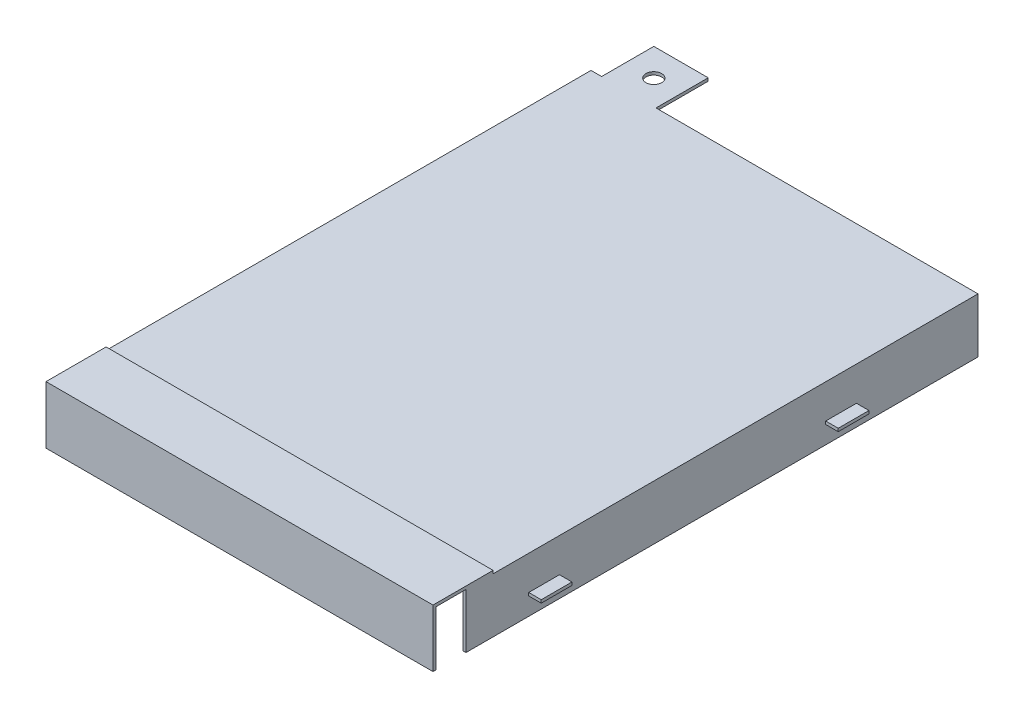
ISO-10303-21;
HEADER;
FILE_DESCRIPTION(('STEP AP214'),'2;1');
FILE_NAME('part.step','',(''),(''),'','','');
FILE_SCHEMA(('AUTOMOTIVE_DESIGN { 1 0 10303 214 1 1 1 1 }'));
ENDSEC;
DATA;
#1=APPLICATION_CONTEXT('core data for automotive mechanical design processes');
#2=APPLICATION_PROTOCOL_DEFINITION('international standard','automotive_design',2000,#1);
#3=PRODUCT_CONTEXT('',#1,'mechanical');
#4=PRODUCT('Part','Part','',(#3));
#5=PRODUCT_RELATED_PRODUCT_CATEGORY('part','',(#4));
#6=PRODUCT_DEFINITION_FORMATION('','',#4);
#7=PRODUCT_DEFINITION_CONTEXT('part definition',#1,'design');
#8=PRODUCT_DEFINITION('design','',#6,#7);
#9=PRODUCT_DEFINITION_SHAPE('','',#8);
#10=(LENGTH_UNIT() NAMED_UNIT(*) SI_UNIT(.MILLI.,.METRE.));
#11=(NAMED_UNIT(*) PLANE_ANGLE_UNIT() SI_UNIT($,.RADIAN.));
#12=(NAMED_UNIT(*) SI_UNIT($,.STERADIAN.) SOLID_ANGLE_UNIT());
#13=UNCERTAINTY_MEASURE_WITH_UNIT(LENGTH_MEASURE(1.E-05),#10,'distance_accuracy_value','');
#14=(GEOMETRIC_REPRESENTATION_CONTEXT(3) GLOBAL_UNCERTAINTY_ASSIGNED_CONTEXT((#13)) GLOBAL_UNIT_ASSIGNED_CONTEXT((#10,
#11,#12)) REPRESENTATION_CONTEXT('',''));
#15=CARTESIAN_POINT('',(0.,0.,0.));
#16=DIRECTION('',(0.,0.,1.));
#17=DIRECTION('',(1.,0.,0.));
#18=AXIS2_PLACEMENT_3D('',#15,#16,#17);
#19=CARTESIAN_POINT('',(-35.575,0.55,-47.075));
#20=DIRECTION('',(1.,0.,0.));
#21=DIRECTION('',(0.,0.,-1.));
#22=AXIS2_PLACEMENT_3D('',#19,#20,#21);
#23=PLANE('',#22);
#24=DIRECTION('',(0.,-1.,0.));
#25=VECTOR('',#24,1.);
#26=CARTESIAN_POINT('',(-35.575,-5.7,-24.725));
#27=LINE('',#26,#25);
#28=CARTESIAN_POINT('',(-35.575,-5.7,-24.725));
#29=VERTEX_POINT('',#28);
#30=CARTESIAN_POINT('',(-35.575,-6.25,-24.725));
#31=VERTEX_POINT('',#30);
#32=EDGE_CURVE('E357',#29,#31,#27,.T.);
#33=ORIENTED_EDGE('',*,*,#32,.F.);
#34=DIRECTION('',(0.,0.,-1.));
#35=VECTOR('',#34,1.);
#36=CARTESIAN_POINT('',(-35.575,-5.7,-24.725));
#37=LINE('',#36,#35);
#38=CARTESIAN_POINT('',(-35.575,-5.7,-19.075));
#39=VERTEX_POINT('',#38);
#40=EDGE_CURVE('E362',#39,#29,#37,.T.);
#41=ORIENTED_EDGE('',*,*,#40,.F.);
#42=DIRECTION('',(0.,1.,0.));
#43=VECTOR('',#42,1.);
#44=CARTESIAN_POINT('',(-35.575,-5.7,-19.075));
#45=LINE('',#44,#43);
#46=CARTESIAN_POINT('',(-35.575,-6.25,-19.075));
#47=VERTEX_POINT('',#46);
#48=EDGE_CURVE('E374',#47,#39,#45,.T.);
#49=ORIENTED_EDGE('',*,*,#48,.F.);
#50=DIRECTION('',(0.,0.,1.));
#51=VECTOR('',#50,1.);
#52=CARTESIAN_POINT('',(-35.575,-6.25,-24.725));
#53=LINE('',#52,#51);
#54=EDGE_CURVE('E371',#31,#47,#53,.T.);
#55=ORIENTED_EDGE('',*,*,#54,.F.);
#56=EDGE_LOOP('',(#33,#41,#49,#55));
#57=FACE_BOUND('',#56,.T.);
#58=DIRECTION('',(0.,-1.,0.));
#59=VECTOR('',#58,1.);
#60=CARTESIAN_POINT('',(-35.575,0.55,-47.075));
#61=LINE('',#60,#59);
#62=CARTESIAN_POINT('',(-35.575,0.55,-47.075));
#63=VERTEX_POINT('',#62);
#64=CARTESIAN_POINT('',(-35.575,-9.5,-47.075));
#65=VERTEX_POINT('',#64);
#66=EDGE_CURVE('E515',#63,#65,#61,.T.);
#67=ORIENTED_EDGE('',*,*,#66,.T.);
#68=DIRECTION('',(0.,0.,-1.));
#69=VECTOR('',#68,1.);
#70=CARTESIAN_POINT('',(-35.575,-9.5,47.075));
#71=LINE('',#70,#69);
#72=CARTESIAN_POINT('',(-35.575,-9.5,47.075));
#73=VERTEX_POINT('',#72);
#74=EDGE_CURVE('E484',#73,#65,#71,.T.);
#75=ORIENTED_EDGE('',*,*,#74,.F.);
#76=DIRECTION('',(0.,-1.,0.));
#77=VECTOR('',#76,1.);
#78=CARTESIAN_POINT('',(-35.575,0.55,47.075));
#79=LINE('',#78,#77);
#80=CARTESIAN_POINT('',(-35.575,0.55,47.075));
#81=VERTEX_POINT('',#80);
#82=EDGE_CURVE('E11',#81,#73,#79,.T.);
#83=ORIENTED_EDGE('',*,*,#82,.F.);
#84=DIRECTION('',(0.,0.,1.));
#85=VECTOR('',#84,1.);
#86=CARTESIAN_POINT('',(-35.575,0.55,52.575));
#87=LINE('',#86,#85);
#88=CARTESIAN_POINT('',(-35.575,0.55,52.575));
#89=VERTEX_POINT('',#88);
#90=EDGE_CURVE('E390',#81,#89,#87,.T.);
#91=ORIENTED_EDGE('',*,*,#90,.T.);
#92=DIRECTION('',(0.,-1.,0.));
#93=VECTOR('',#92,1.);
#94=CARTESIAN_POINT('',(-35.575,-9.5,52.575));
#95=LINE('',#94,#93);
#96=CARTESIAN_POINT('',(-35.575,-9.5,52.575));
#97=VERTEX_POINT('',#96);
#98=EDGE_CURVE('E405',#89,#97,#95,.T.);
#99=ORIENTED_EDGE('',*,*,#98,.T.);
#100=DIRECTION('',(0.,0.,1.));
#101=VECTOR('',#100,1.);
#102=CARTESIAN_POINT('',(-35.575,-9.5,53.125));
#103=LINE('',#102,#101);
#104=CARTESIAN_POINT('',(-35.575,-9.5,53.125));
#105=VERTEX_POINT('',#104);
#106=EDGE_CURVE('E408',#97,#105,#103,.T.);
#107=ORIENTED_EDGE('',*,*,#106,.T.);
#108=DIRECTION('',(0.,1.,0.));
#109=VECTOR('',#108,1.);
#110=CARTESIAN_POINT('',(-35.575,1.1,53.125));
#111=LINE('',#110,#109);
#112=CARTESIAN_POINT('',(-35.575,1.1,53.125));
#113=VERTEX_POINT('',#112);
#114=EDGE_CURVE('E411',#105,#113,#111,.T.);
#115=ORIENTED_EDGE('',*,*,#114,.T.);
#116=DIRECTION('',(0.,0.,-1.));
#117=VECTOR('',#116,1.);
#118=CARTESIAN_POINT('',(-35.575,1.1,42.075));
#119=LINE('',#118,#117);
#120=CARTESIAN_POINT('',(-35.575,1.1,42.075));
#121=VERTEX_POINT('',#120);
#122=EDGE_CURVE('E414',#113,#121,#119,.T.);
#123=ORIENTED_EDGE('',*,*,#122,.T.);
#124=DIRECTION('',(0.,-1.,0.));
#125=VECTOR('',#124,1.);
#126=CARTESIAN_POINT('',(-35.575,0.55,42.075));
#127=LINE('',#126,#125);
#128=CARTESIAN_POINT('',(-35.575,0.55,42.075));
#129=VERTEX_POINT('',#128);
#130=EDGE_CURVE('E417',#121,#129,#127,.T.);
#131=ORIENTED_EDGE('',*,*,#130,.T.);
#132=DIRECTION('',(0.,0.,1.));
#133=VECTOR('',#132,1.);
#134=CARTESIAN_POINT('',(-35.575,0.55,-47.075));
#135=LINE('',#134,#133);
#136=EDGE_CURVE('E503',#63,#129,#135,.T.);
#137=ORIENTED_EDGE('',*,*,#136,.F.);
#138=EDGE_LOOP('',(#67,#75,#83,#91,#99,#107,#115,#123,#131,#137));
#139=FACE_BOUND('',#138,.T.);
#140=DIRECTION('',(0.,-1.,0.));
#141=VECTOR('',#140,1.);
#142=CARTESIAN_POINT('',(-35.575,-5.7,29.875));
#143=LINE('',#142,#141);
#144=CARTESIAN_POINT('',(-35.575,-5.7,29.875));
#145=VERTEX_POINT('',#144);
#146=CARTESIAN_POINT('',(-35.575,-6.25,29.875));
#147=VERTEX_POINT('',#146);
#148=EDGE_CURVE('E324',#145,#147,#143,.T.);
#149=ORIENTED_EDGE('',*,*,#148,.F.);
#150=DIRECTION('',(0.,0.,-1.));
#151=VECTOR('',#150,1.);
#152=CARTESIAN_POINT('',(-35.575,-5.7,29.875));
#153=LINE('',#152,#151);
#154=CARTESIAN_POINT('',(-35.575,-5.7,35.525));
#155=VERTEX_POINT('',#154);
#156=EDGE_CURVE('E329',#155,#145,#153,.T.);
#157=ORIENTED_EDGE('',*,*,#156,.F.);
#158=DIRECTION('',(0.,1.,0.));
#159=VECTOR('',#158,1.);
#160=CARTESIAN_POINT('',(-35.575,-5.7,35.525));
#161=LINE('',#160,#159);
#162=CARTESIAN_POINT('',(-35.575,-6.25,35.525));
#163=VERTEX_POINT('',#162);
#164=EDGE_CURVE('E341',#163,#155,#161,.T.);
#165=ORIENTED_EDGE('',*,*,#164,.F.);
#166=DIRECTION('',(0.,0.,1.));
#167=VECTOR('',#166,1.);
#168=CARTESIAN_POINT('',(-35.575,-6.25,29.875));
#169=LINE('',#168,#167);
#170=EDGE_CURVE('E338',#147,#163,#169,.T.);
#171=ORIENTED_EDGE('',*,*,#170,.F.);
#172=EDGE_LOOP('',(#149,#157,#165,#171));
#173=FACE_BOUND('',#172,.T.);
#174=ADVANCED_FACE('F35',(#57,#139,#173),#23,.F.);
#175=CARTESIAN_POINT('',(35.575,0.55,-47.075));
#176=DIRECTION('',(0.,0.,1.));
#177=DIRECTION('',(1.,0.,0.));
#178=AXIS2_PLACEMENT_3D('',#175,#176,#177);
#179=PLANE('',#178);
#180=DIRECTION('',(0.,1.,0.));
#181=VECTOR('',#180,1.);
#182=CARTESIAN_POINT('',(-33.625,-13.8621787609308,-47.075));
#183=LINE('',#182,#181);
#184=CARTESIAN_POINT('',(-33.625,0.,-47.075));
#185=VERTEX_POINT('',#184);
#186=CARTESIAN_POINT('',(-33.625,0.55,-47.075));
#187=VERTEX_POINT('',#186);
#188=EDGE_CURVE('E452',#185,#187,#183,.T.);
#189=ORIENTED_EDGE('',*,*,#188,.F.);
#190=DIRECTION('',(-1.,0.,0.));
#191=VECTOR('',#190,1.);
#192=CARTESIAN_POINT('',(35.575,0.,-47.075));
#193=LINE('',#192,#191);
#194=CARTESIAN_POINT('',(-35.025,0.,-47.075));
#195=VERTEX_POINT('',#194);
#196=EDGE_CURVE('E518',#185,#195,#193,.T.);
#197=ORIENTED_EDGE('',*,*,#196,.T.);
#198=DIRECTION('',(0.,1.,0.));
#199=VECTOR('',#198,1.);
#200=CARTESIAN_POINT('',(-35.025,-9.5,-47.075));
#201=LINE('',#200,#199);
#202=CARTESIAN_POINT('',(-35.025,-9.5,-47.075));
#203=VERTEX_POINT('',#202);
#204=EDGE_CURVE('E499',#203,#195,#201,.T.);
#205=ORIENTED_EDGE('',*,*,#204,.F.);
#206=DIRECTION('',(1.,0.,0.));
#207=VECTOR('',#206,1.);
#208=CARTESIAN_POINT('',(-35.575,-9.5,-47.075));
#209=LINE('',#208,#207);
#210=EDGE_CURVE('E487',#65,#203,#209,.T.);
#211=ORIENTED_EDGE('',*,*,#210,.F.);
#212=ORIENTED_EDGE('',*,*,#66,.F.);
#213=DIRECTION('',(-1.,0.,0.));
#214=VECTOR('',#213,1.);
#215=CARTESIAN_POINT('',(35.575,0.55,-47.075));
#216=LINE('',#215,#214);
#217=EDGE_CURVE('E511',#187,#63,#216,.T.);
#218=ORIENTED_EDGE('',*,*,#217,.F.);
#219=EDGE_LOOP('',(#189,#197,#205,#211,#212,#218));
#220=FACE_BOUND('',#219,.T.);
#221=ADVANCED_FACE('F604',(#220),#179,.F.);
#222=CARTESIAN_POINT('',(0.,0.,0.));
#223=DIRECTION('',(0.,-1.,0.));
#224=DIRECTION('',(0.,0.,-1.));
#225=AXIS2_PLACEMENT_3D('',#222,#223,#224);
#226=PLANE('',#225);
#227=CARTESIAN_POINT('',(-28.575,0.,-51.625));
#228=DIRECTION('',(0.,-1.,0.));
#229=DIRECTION('',(0.,0.,-1.));
#230=AXIS2_PLACEMENT_3D('',#227,#228,#229);
#231=CIRCLE('',#230,1.45);
#232=CARTESIAN_POINT('',(-28.575,0.,-53.075));
#233=VERTEX_POINT('',#232);
#234=EDGE_CURVE('E437',#233,#233,#231,.F.);
#235=ORIENTED_EDGE('',*,*,#234,.T.);
#236=EDGE_LOOP('',(#235));
#237=FACE_BOUND('',#236,.T.);
#238=CARTESIAN_POINT('',(35.025,0.,-47.075));
#239=VERTEX_POINT('',#238);
#240=CARTESIAN_POINT('',(-23.625,0.,-47.075));
#241=VERTEX_POINT('',#240);
#242=EDGE_CURVE('E506',#239,#241,#193,.T.);
#243=ORIENTED_EDGE('',*,*,#242,.F.);
#244=DIRECTION('',(0.,0.,-1.));
#245=VECTOR('',#244,1.);
#246=CARTESIAN_POINT('',(35.025,0.,47.075));
#247=LINE('',#246,#245);
#248=CARTESIAN_POINT('',(35.025,0.,47.075));
#249=VERTEX_POINT('',#248);
#250=EDGE_CURVE('E466',#249,#239,#247,.T.);
#251=ORIENTED_EDGE('',*,*,#250,.F.);
#252=DIRECTION('',(1.,0.,0.));
#253=VECTOR('',#252,1.);
#254=CARTESIAN_POINT('',(35.575,0.,47.075));
#255=LINE('',#254,#253);
#256=CARTESIAN_POINT('',(-35.025,0.,47.075));
#257=VERTEX_POINT('',#256);
#258=EDGE_CURVE('E502',#257,#249,#255,.T.);
#259=ORIENTED_EDGE('',*,*,#258,.F.);
#260=DIRECTION('',(0.,0.,1.));
#261=VECTOR('',#260,1.);
#262=CARTESIAN_POINT('',(-35.025,0.,47.075));
#263=LINE('',#262,#261);
#264=EDGE_CURVE('E483',#195,#257,#263,.T.);
#265=ORIENTED_EDGE('',*,*,#264,.F.);
#266=ORIENTED_EDGE('',*,*,#196,.F.);
#267=DIRECTION('',(0.,0.,1.));
#268=VECTOR('',#267,1.);
#269=CARTESIAN_POINT('',(-33.625,0.,-47.075));
#270=LINE('',#269,#268);
#271=CARTESIAN_POINT('',(-33.625,0.,-56.675));
#272=VERTEX_POINT('',#271);
#273=EDGE_CURVE('E450',#272,#185,#270,.T.);
#274=ORIENTED_EDGE('',*,*,#273,.F.);
#275=DIRECTION('',(-1.,0.,0.));
#276=VECTOR('',#275,1.);
#277=CARTESIAN_POINT('',(-33.625,0.,-56.675));
#278=LINE('',#277,#276);
#279=CARTESIAN_POINT('',(-23.625,0.,-56.675));
#280=VERTEX_POINT('',#279);
#281=EDGE_CURVE('E454',#280,#272,#278,.T.);
#282=ORIENTED_EDGE('',*,*,#281,.F.);
#283=DIRECTION('',(0.,0.,-1.));
#284=VECTOR('',#283,1.);
#285=CARTESIAN_POINT('',(-23.625,0.,-47.075));
#286=LINE('',#285,#284);
#287=EDGE_CURVE('E458',#241,#280,#286,.T.);
#288=ORIENTED_EDGE('',*,*,#287,.F.);
#289=EDGE_LOOP('',(#243,#251,#259,#265,#266,#274,#282,#288));
#290=FACE_BOUND('',#289,.T.);
#291=ADVANCED_FACE('F590',(#237,#290),#226,.T.);
#292=CARTESIAN_POINT('',(35.575,0.55,47.075));
#293=DIRECTION('',(0.,0.,-1.));
#294=DIRECTION('',(-1.,0.,0.));
#295=AXIS2_PLACEMENT_3D('',#292,#293,#294);
#296=PLANE('',#295);
#297=ORIENTED_EDGE('',*,*,#82,.T.);
#298=DIRECTION('',(-1.,0.,0.));
#299=VECTOR('',#298,1.);
#300=CARTESIAN_POINT('',(-35.575,-9.5,47.075));
#301=LINE('',#300,#299);
#302=CARTESIAN_POINT('',(-35.025,-9.5,47.075));
#303=VERTEX_POINT('',#302);
#304=EDGE_CURVE('E491',#303,#73,#301,.T.);
#305=ORIENTED_EDGE('',*,*,#304,.F.);
#306=DIRECTION('',(0.,1.,0.));
#307=VECTOR('',#306,1.);
#308=CARTESIAN_POINT('',(-35.025,-9.5,47.075));
#309=LINE('',#308,#307);
#310=EDGE_CURVE('E494',#303,#257,#309,.T.);
#311=ORIENTED_EDGE('',*,*,#310,.T.);
#312=ORIENTED_EDGE('',*,*,#258,.T.);
#313=DIRECTION('',(0.,1.,0.));
#314=VECTOR('',#313,1.);
#315=CARTESIAN_POINT('',(35.025,-9.5,47.075));
#316=LINE('',#315,#314);
#317=CARTESIAN_POINT('',(35.025,-9.5,47.075));
#318=VERTEX_POINT('',#317);
#319=EDGE_CURVE('E481',#318,#249,#316,.T.);
#320=ORIENTED_EDGE('',*,*,#319,.F.);
#321=DIRECTION('',(-1.,0.,0.));
#322=VECTOR('',#321,1.);
#323=CARTESIAN_POINT('',(35.575,-9.5,47.075));
#324=LINE('',#323,#322);
#325=CARTESIAN_POINT('',(35.575,-9.5,47.075));
#326=VERTEX_POINT('',#325);
#327=EDGE_CURVE('E470',#326,#318,#324,.T.);
#328=ORIENTED_EDGE('',*,*,#327,.F.);
#329=DIRECTION('',(0.,-1.,0.));
#330=VECTOR('',#329,1.);
#331=CARTESIAN_POINT('',(35.575,0.55,47.075));
#332=LINE('',#331,#330);
#333=CARTESIAN_POINT('',(35.575,0.55,47.075));
#334=VERTEX_POINT('',#333);
#335=EDGE_CURVE('E42',#334,#326,#332,.T.);
#336=ORIENTED_EDGE('',*,*,#335,.F.);
#337=DIRECTION('',(1.,0.,0.));
#338=VECTOR('',#337,1.);
#339=CARTESIAN_POINT('',(35.575,0.55,47.075));
#340=LINE('',#339,#338);
#341=EDGE_CURVE('E505',#81,#334,#340,.T.);
#342=ORIENTED_EDGE('',*,*,#341,.F.);
#343=EDGE_LOOP('',(#297,#305,#311,#312,#320,#328,#336,#342));
#344=FACE_BOUND('',#343,.T.);
#345=ADVANCED_FACE('F531',(#344),#296,.F.);
#346=CARTESIAN_POINT('',(35.575,0.55,-47.075));
#347=DIRECTION('',(-1.,0.,0.));
#348=DIRECTION('',(0.,0.,1.));
#349=AXIS2_PLACEMENT_3D('',#346,#347,#348);
#350=PLANE('',#349);
#351=DIRECTION('',(0.,0.,-1.));
#352=VECTOR('',#351,1.);
#353=CARTESIAN_POINT('',(35.575,-5.7,29.875));
#354=LINE('',#353,#352);
#355=CARTESIAN_POINT('',(35.575,-5.7,35.525));
#356=VERTEX_POINT('',#355);
#357=CARTESIAN_POINT('',(35.575,-5.7,29.875));
#358=VERTEX_POINT('',#357);
#359=EDGE_CURVE('E286',#356,#358,#354,.T.);
#360=ORIENTED_EDGE('',*,*,#359,.T.);
#361=DIRECTION('',(0.,-1.,0.));
#362=VECTOR('',#361,1.);
#363=CARTESIAN_POINT('',(35.575,-5.7,29.875));
#364=LINE('',#363,#362);
#365=CARTESIAN_POINT('',(35.575,-6.25,29.875));
#366=VERTEX_POINT('',#365);
#367=EDGE_CURVE('E260',#358,#366,#364,.T.);
#368=ORIENTED_EDGE('',*,*,#367,.T.);
#369=DIRECTION('',(0.,0.,1.));
#370=VECTOR('',#369,1.);
#371=CARTESIAN_POINT('',(35.575,-6.25,29.875));
#372=LINE('',#371,#370);
#373=CARTESIAN_POINT('',(35.575,-6.25,35.525));
#374=VERTEX_POINT('',#373);
#375=EDGE_CURVE('E276',#366,#374,#372,.T.);
#376=ORIENTED_EDGE('',*,*,#375,.T.);
#377=DIRECTION('',(0.,1.,0.));
#378=VECTOR('',#377,1.);
#379=CARTESIAN_POINT('',(35.575,-5.7,35.525));
#380=LINE('',#379,#378);
#381=EDGE_CURVE('E49',#374,#356,#380,.T.);
#382=ORIENTED_EDGE('',*,*,#381,.T.);
#383=EDGE_LOOP('',(#360,#368,#376,#382));
#384=FACE_BOUND('',#383,.T.);
#385=DIRECTION('',(0.,0.,-1.));
#386=VECTOR('',#385,1.);
#387=CARTESIAN_POINT('',(35.575,-5.7,-24.725));
#388=LINE('',#387,#386);
#389=CARTESIAN_POINT('',(35.575,-5.7,-19.075));
#390=VERTEX_POINT('',#389);
#391=CARTESIAN_POINT('',(35.575,-5.7,-24.725));
#392=VERTEX_POINT('',#391);
#393=EDGE_CURVE('E311',#390,#392,#388,.T.);
#394=ORIENTED_EDGE('',*,*,#393,.T.);
#395=DIRECTION('',(0.,-1.,0.));
#396=VECTOR('',#395,1.);
#397=CARTESIAN_POINT('',(35.575,-5.7,-24.725));
#398=LINE('',#397,#396);
#399=CARTESIAN_POINT('',(35.575,-6.25,-24.725));
#400=VERTEX_POINT('',#399);
#401=EDGE_CURVE('E265',#392,#400,#398,.T.);
#402=ORIENTED_EDGE('',*,*,#401,.T.);
#403=DIRECTION('',(0.,0.,1.));
#404=VECTOR('',#403,1.);
#405=CARTESIAN_POINT('',(35.575,-6.25,-24.725));
#406=LINE('',#405,#404);
#407=CARTESIAN_POINT('',(35.575,-6.25,-19.075));
#408=VERTEX_POINT('',#407);
#409=EDGE_CURVE('E299',#400,#408,#406,.T.);
#410=ORIENTED_EDGE('',*,*,#409,.T.);
#411=DIRECTION('',(0.,1.,0.));
#412=VECTOR('',#411,1.);
#413=CARTESIAN_POINT('',(35.575,-5.7,-19.075));
#414=LINE('',#413,#412);
#415=EDGE_CURVE('E57',#408,#390,#414,.T.);
#416=ORIENTED_EDGE('',*,*,#415,.T.);
#417=EDGE_LOOP('',(#394,#402,#410,#416));
#418=FACE_BOUND('',#417,.T.);
#419=ORIENTED_EDGE('',*,*,#335,.T.);
#420=DIRECTION('',(0.,0.,1.));
#421=VECTOR('',#420,1.);
#422=CARTESIAN_POINT('',(35.575,-9.5,47.075));
#423=LINE('',#422,#421);
#424=CARTESIAN_POINT('',(35.575,-9.5,-47.075));
#425=VERTEX_POINT('',#424);
#426=EDGE_CURVE('E467',#425,#326,#423,.T.);
#427=ORIENTED_EDGE('',*,*,#426,.F.);
#428=DIRECTION('',(0.,-1.,0.));
#429=VECTOR('',#428,1.);
#430=CARTESIAN_POINT('',(35.575,0.55,-47.075));
#431=LINE('',#430,#429);
#432=CARTESIAN_POINT('',(35.575,0.55,-47.075));
#433=VERTEX_POINT('',#432);
#434=EDGE_CURVE('E522',#433,#425,#431,.T.);
#435=ORIENTED_EDGE('',*,*,#434,.F.);
#436=DIRECTION('',(0.,0.,-1.));
#437=VECTOR('',#436,1.);
#438=CARTESIAN_POINT('',(35.575,0.55,-47.075));
#439=LINE('',#438,#437);
#440=CARTESIAN_POINT('',(35.575,0.55,42.075));
#441=VERTEX_POINT('',#440);
#442=EDGE_CURVE('E509',#441,#433,#439,.T.);
#443=ORIENTED_EDGE('',*,*,#442,.F.);
#444=DIRECTION('',(0.,1.,0.));
#445=VECTOR('',#444,1.);
#446=CARTESIAN_POINT('',(35.575,0.55,42.075));
#447=LINE('',#446,#445);
#448=CARTESIAN_POINT('',(35.575,1.1,42.075));
#449=VERTEX_POINT('',#448);
#450=EDGE_CURVE('E398',#441,#449,#447,.T.);
#451=ORIENTED_EDGE('',*,*,#450,.T.);
#452=DIRECTION('',(0.,0.,1.));
#453=VECTOR('',#452,1.);
#454=CARTESIAN_POINT('',(35.575,1.1,42.075));
#455=LINE('',#454,#453);
#456=CARTESIAN_POINT('',(35.575,1.1,53.125));
#457=VERTEX_POINT('',#456);
#458=EDGE_CURVE('E396',#449,#457,#455,.T.);
#459=ORIENTED_EDGE('',*,*,#458,.T.);
#460=DIRECTION('',(0.,-1.,0.));
#461=VECTOR('',#460,1.);
#462=CARTESIAN_POINT('',(35.575,1.1,53.125));
#463=LINE('',#462,#461);
#464=CARTESIAN_POINT('',(35.575,-9.5,53.125));
#465=VERTEX_POINT('',#464);
#466=EDGE_CURVE('E393',#457,#465,#463,.T.);
#467=ORIENTED_EDGE('',*,*,#466,.T.);
#468=DIRECTION('',(0.,0.,-1.));
#469=VECTOR('',#468,1.);
#470=CARTESIAN_POINT('',(35.575,-9.5,53.125));
#471=LINE('',#470,#469);
#472=CARTESIAN_POINT('',(35.575,-9.5,52.575));
#473=VERTEX_POINT('',#472);
#474=EDGE_CURVE('E391',#465,#473,#471,.T.);
#475=ORIENTED_EDGE('',*,*,#474,.T.);
#476=DIRECTION('',(0.,1.,0.));
#477=VECTOR('',#476,1.);
#478=CARTESIAN_POINT('',(35.575,-9.5,52.575));
#479=LINE('',#478,#477);
#480=CARTESIAN_POINT('',(35.575,0.55,52.575));
#481=VERTEX_POINT('',#480);
#482=EDGE_CURVE('E403',#473,#481,#479,.T.);
#483=ORIENTED_EDGE('',*,*,#482,.T.);
#484=DIRECTION('',(0.,0.,-1.));
#485=VECTOR('',#484,1.);
#486=CARTESIAN_POINT('',(35.575,0.55,52.575));
#487=LINE('',#486,#485);
#488=EDGE_CURVE('E400',#481,#334,#487,.T.);
#489=ORIENTED_EDGE('',*,*,#488,.T.);
#490=EDGE_LOOP('',(#419,#427,#435,#443,#451,#459,#467,#475,#483,#489));
#491=FACE_BOUND('',#490,.T.);
#492=ADVANCED_FACE('F526',(#384,#418,#491),#350,.F.);
#493=ORIENTED_EDGE('',*,*,#242,.T.);
#494=DIRECTION('',(0.,1.,0.));
#495=VECTOR('',#494,1.);
#496=CARTESIAN_POINT('',(-23.625,-13.8621787609308,-47.075));
#497=LINE('',#496,#495);
#498=CARTESIAN_POINT('',(-23.625,0.55,-47.075));
#499=VERTEX_POINT('',#498);
#500=EDGE_CURVE('E444',#241,#499,#497,.T.);
#501=ORIENTED_EDGE('',*,*,#500,.T.);
#502=EDGE_CURVE('E512',#433,#499,#216,.T.);
#503=ORIENTED_EDGE('',*,*,#502,.F.);
#504=ORIENTED_EDGE('',*,*,#434,.T.);
#505=DIRECTION('',(1.,0.,0.));
#506=VECTOR('',#505,1.);
#507=CARTESIAN_POINT('',(35.575,-9.5,-47.075));
#508=LINE('',#507,#506);
#509=CARTESIAN_POINT('',(35.025,-9.5,-47.075));
#510=VERTEX_POINT('',#509);
#511=EDGE_CURVE('E474',#510,#425,#508,.T.);
#512=ORIENTED_EDGE('',*,*,#511,.F.);
#513=DIRECTION('',(0.,1.,0.));
#514=VECTOR('',#513,1.);
#515=CARTESIAN_POINT('',(35.025,-9.5,-47.075));
#516=LINE('',#515,#514);
#517=EDGE_CURVE('E477',#510,#239,#516,.T.);
#518=ORIENTED_EDGE('',*,*,#517,.T.);
#519=EDGE_LOOP('',(#493,#501,#503,#504,#512,#518));
#520=FACE_BOUND('',#519,.T.);
#521=ADVANCED_FACE('F538',(#520),#179,.F.);
#522=CARTESIAN_POINT('',(0.,0.55,0.));
#523=DIRECTION('',(0.,-1.,0.));
#524=DIRECTION('',(0.,0.,-1.));
#525=AXIS2_PLACEMENT_3D('',#522,#523,#524);
#526=PLANE('',#525);
#527=CARTESIAN_POINT('',(-28.575,0.55,-51.625));
#528=DIRECTION('',(0.,1.,0.));
#529=DIRECTION('',(0.,0.,1.));
#530=AXIS2_PLACEMENT_3D('',#527,#528,#529);
#531=CIRCLE('',#530,1.45);
#532=CARTESIAN_POINT('',(-28.575,0.55,-50.175));
#533=VERTEX_POINT('',#532);
#534=EDGE_CURVE('E434',#533,#533,#531,.T.);
#535=ORIENTED_EDGE('',*,*,#534,.F.);
#536=EDGE_LOOP('',(#535));
#537=FACE_BOUND('',#536,.T.);
#538=ORIENTED_EDGE('',*,*,#136,.T.);
#539=DIRECTION('',(-1.,0.,0.));
#540=VECTOR('',#539,1.);
#541=CARTESIAN_POINT('',(50.8871683637557,0.55,42.075));
#542=LINE('',#541,#540);
#543=EDGE_CURVE('E394',#441,#129,#542,.T.);
#544=ORIENTED_EDGE('',*,*,#543,.F.);
#545=ORIENTED_EDGE('',*,*,#442,.T.);
#546=ORIENTED_EDGE('',*,*,#502,.T.);
#547=DIRECTION('',(0.,0.,-1.));
#548=VECTOR('',#547,1.);
#549=CARTESIAN_POINT('',(-23.625,0.55,-47.075));
#550=LINE('',#549,#548);
#551=CARTESIAN_POINT('',(-23.625,0.55,-56.675));
#552=VERTEX_POINT('',#551);
#553=EDGE_CURVE('E445',#499,#552,#550,.T.);
#554=ORIENTED_EDGE('',*,*,#553,.T.);
#555=DIRECTION('',(-1.,0.,0.));
#556=VECTOR('',#555,1.);
#557=CARTESIAN_POINT('',(-33.625,0.55,-56.675));
#558=LINE('',#557,#556);
#559=CARTESIAN_POINT('',(-33.625,0.55,-56.675));
#560=VERTEX_POINT('',#559);
#561=EDGE_CURVE('E441',#552,#560,#558,.T.);
#562=ORIENTED_EDGE('',*,*,#561,.T.);
#563=DIRECTION('',(0.,0.,1.));
#564=VECTOR('',#563,1.);
#565=CARTESIAN_POINT('',(-33.625,0.55,-47.075));
#566=LINE('',#565,#564);
#567=EDGE_CURVE('E440',#560,#187,#566,.T.);
#568=ORIENTED_EDGE('',*,*,#567,.T.);
#569=ORIENTED_EDGE('',*,*,#217,.T.);
#570=EDGE_LOOP('',(#538,#544,#545,#546,#554,#562,#568,#569));
#571=FACE_BOUND('',#570,.T.);
#572=ADVANCED_FACE('F544',(#537,#571),#526,.F.);
#573=CARTESIAN_POINT('',(-35.025,-9.5,47.075));
#574=DIRECTION('',(-1.,0.,0.));
#575=DIRECTION('',(0.,0.,1.));
#576=AXIS2_PLACEMENT_3D('',#573,#574,#575);
#577=PLANE('',#576);
#578=ORIENTED_EDGE('',*,*,#264,.T.);
#579=ORIENTED_EDGE('',*,*,#310,.F.);
#580=DIRECTION('',(0.,0.,1.));
#581=VECTOR('',#580,1.);
#582=CARTESIAN_POINT('',(-35.025,-9.5,47.075));
#583=LINE('',#582,#581);
#584=EDGE_CURVE('E489',#203,#303,#583,.T.);
#585=ORIENTED_EDGE('',*,*,#584,.F.);
#586=ORIENTED_EDGE('',*,*,#204,.T.);
#587=EDGE_LOOP('',(#578,#579,#585,#586));
#588=FACE_BOUND('',#587,.T.);
#589=ADVANCED_FACE('F585',(#588),#577,.F.);
#590=CARTESIAN_POINT('',(0.,-9.5,0.));
#591=DIRECTION('',(0.,-1.,0.));
#592=DIRECTION('',(0.,0.,-1.));
#593=AXIS2_PLACEMENT_3D('',#590,#591,#592);
#594=PLANE('',#593);
#595=ORIENTED_EDGE('',*,*,#74,.T.);
#596=ORIENTED_EDGE('',*,*,#210,.T.);
#597=ORIENTED_EDGE('',*,*,#584,.T.);
#598=ORIENTED_EDGE('',*,*,#304,.T.);
#599=EDGE_LOOP('',(#595,#596,#597,#598));
#600=FACE_BOUND('',#599,.T.);
#601=ADVANCED_FACE('F580',(#600),#594,.T.);
#602=CARTESIAN_POINT('',(35.025,-9.5,47.075));
#603=DIRECTION('',(1.,0.,0.));
#604=DIRECTION('',(0.,0.,-1.));
#605=AXIS2_PLACEMENT_3D('',#602,#603,#604);
#606=PLANE('',#605);
#607=ORIENTED_EDGE('',*,*,#250,.T.);
#608=ORIENTED_EDGE('',*,*,#517,.F.);
#609=DIRECTION('',(0.,0.,-1.));
#610=VECTOR('',#609,1.);
#611=CARTESIAN_POINT('',(35.025,-9.5,47.075));
#612=LINE('',#611,#610);
#613=EDGE_CURVE('E472',#318,#510,#612,.T.);
#614=ORIENTED_EDGE('',*,*,#613,.F.);
#615=ORIENTED_EDGE('',*,*,#319,.T.);
#616=EDGE_LOOP('',(#607,#608,#614,#615));
#617=FACE_BOUND('',#616,.T.);
#618=ADVANCED_FACE('F593',(#617),#606,.F.);
#619=CARTESIAN_POINT('',(0.,-9.5,0.));
#620=DIRECTION('',(0.,1.,0.));
#621=DIRECTION('',(0.,0.,1.));
#622=AXIS2_PLACEMENT_3D('',#619,#620,#621);
#623=PLANE('',#622);
#624=ORIENTED_EDGE('',*,*,#426,.T.);
#625=ORIENTED_EDGE('',*,*,#327,.T.);
#626=ORIENTED_EDGE('',*,*,#613,.T.);
#627=ORIENTED_EDGE('',*,*,#511,.T.);
#628=EDGE_LOOP('',(#624,#625,#626,#627));
#629=FACE_BOUND('',#628,.T.);
#630=ADVANCED_FACE('F534',(#629),#623,.F.);
#631=CARTESIAN_POINT('',(-23.625,-13.8621787609308,-47.075));
#632=DIRECTION('',(1.,0.,0.));
#633=DIRECTION('',(0.,0.,-1.));
#634=AXIS2_PLACEMENT_3D('',#631,#632,#633);
#635=PLANE('',#634);
#636=ORIENTED_EDGE('',*,*,#500,.F.);
#637=ORIENTED_EDGE('',*,*,#287,.T.);
#638=DIRECTION('',(0.,1.,0.));
#639=VECTOR('',#638,1.);
#640=CARTESIAN_POINT('',(-23.625,-13.8621787609308,-56.675));
#641=LINE('',#640,#639);
#642=EDGE_CURVE('E457',#280,#552,#641,.T.);
#643=ORIENTED_EDGE('',*,*,#642,.T.);
#644=ORIENTED_EDGE('',*,*,#553,.F.);
#645=EDGE_LOOP('',(#636,#637,#643,#644));
#646=FACE_BOUND('',#645,.T.);
#647=ADVANCED_FACE('F600',(#646),#635,.T.);
#648=CARTESIAN_POINT('',(-33.625,-13.8621787609308,-56.675));
#649=DIRECTION('',(0.,0.,-1.));
#650=DIRECTION('',(-1.,0.,0.));
#651=AXIS2_PLACEMENT_3D('',#648,#649,#650);
#652=PLANE('',#651);
#653=ORIENTED_EDGE('',*,*,#642,.F.);
#654=ORIENTED_EDGE('',*,*,#281,.T.);
#655=DIRECTION('',(0.,1.,0.));
#656=VECTOR('',#655,1.);
#657=CARTESIAN_POINT('',(-33.625,-13.8621787609308,-56.675));
#658=LINE('',#657,#656);
#659=EDGE_CURVE('E453',#272,#560,#658,.T.);
#660=ORIENTED_EDGE('',*,*,#659,.T.);
#661=ORIENTED_EDGE('',*,*,#561,.F.);
#662=EDGE_LOOP('',(#653,#654,#660,#661));
#663=FACE_BOUND('',#662,.T.);
#664=ADVANCED_FACE('F659',(#663),#652,.T.);
#665=CARTESIAN_POINT('',(-33.625,-13.8621787609308,-47.075));
#666=DIRECTION('',(-1.,0.,0.));
#667=DIRECTION('',(0.,0.,1.));
#668=AXIS2_PLACEMENT_3D('',#665,#666,#667);
#669=PLANE('',#668);
#670=ORIENTED_EDGE('',*,*,#659,.F.);
#671=ORIENTED_EDGE('',*,*,#273,.T.);
#672=ORIENTED_EDGE('',*,*,#188,.T.);
#673=ORIENTED_EDGE('',*,*,#567,.F.);
#674=EDGE_LOOP('',(#670,#671,#672,#673));
#675=FACE_BOUND('',#674,.T.);
#676=ADVANCED_FACE('F655',(#675),#669,.T.);
#677=CARTESIAN_POINT('',(-28.575,-4.10121933088198,-51.625));
#678=DIRECTION('',(0.,1.,0.));
#679=DIRECTION('',(0.,0.,1.));
#680=AXIS2_PLACEMENT_3D('',#677,#678,#679);
#681=CYLINDRICAL_SURFACE('',#680,1.45);
#682=ORIENTED_EDGE('',*,*,#534,.T.);
#683=EDGE_LOOP('',(#682));
#684=FACE_BOUND('',#683,.T.);
#685=ORIENTED_EDGE('',*,*,#234,.F.);
#686=EDGE_LOOP('',(#685));
#687=FACE_BOUND('',#686,.T.);
#688=ADVANCED_FACE('F652',(#684,#687),#681,.F.);
#689=CARTESIAN_POINT('',(50.8871683637557,0.55,52.575));
#690=DIRECTION('',(0.,-1.,0.));
#691=DIRECTION('',(0.,0.,-1.));
#692=AXIS2_PLACEMENT_3D('',#689,#690,#691);
#693=PLANE('',#692);
#694=ORIENTED_EDGE('',*,*,#341,.T.);
#695=ORIENTED_EDGE('',*,*,#488,.F.);
#696=DIRECTION('',(-1.,0.,0.));
#697=VECTOR('',#696,1.);
#698=CARTESIAN_POINT('',(50.8871683637557,0.55,52.575));
#699=LINE('',#698,#697);
#700=EDGE_CURVE('E420',#481,#89,#699,.T.);
#701=ORIENTED_EDGE('',*,*,#700,.T.);
#702=ORIENTED_EDGE('',*,*,#90,.F.);
#703=EDGE_LOOP('',(#694,#695,#701,#702));
#704=FACE_BOUND('',#703,.T.);
#705=ADVANCED_FACE('F572',(#704),#693,.T.);
#706=CARTESIAN_POINT('',(50.8871683637557,0.55,42.075));
#707=DIRECTION('',(0.,0.,-1.));
#708=DIRECTION('',(0.,1.,0.));
#709=AXIS2_PLACEMENT_3D('',#706,#707,#708);
#710=PLANE('',#709);
#711=ORIENTED_EDGE('',*,*,#450,.F.);
#712=ORIENTED_EDGE('',*,*,#543,.T.);
#713=ORIENTED_EDGE('',*,*,#130,.F.);
#714=DIRECTION('',(-1.,0.,0.));
#715=VECTOR('',#714,1.);
#716=CARTESIAN_POINT('',(50.8871683637557,1.1,42.075));
#717=LINE('',#716,#715);
#718=EDGE_CURVE('E423',#449,#121,#717,.T.);
#719=ORIENTED_EDGE('',*,*,#718,.F.);
#720=EDGE_LOOP('',(#711,#712,#713,#719));
#721=FACE_BOUND('',#720,.T.);
#722=ADVANCED_FACE('F549',(#721),#710,.T.);
#723=CARTESIAN_POINT('',(50.8871683637557,1.1,42.075));
#724=DIRECTION('',(0.,1.,0.));
#725=DIRECTION('',(0.,0.,1.));
#726=AXIS2_PLACEMENT_3D('',#723,#724,#725);
#727=PLANE('',#726);
#728=ORIENTED_EDGE('',*,*,#458,.F.);
#729=ORIENTED_EDGE('',*,*,#718,.T.);
#730=ORIENTED_EDGE('',*,*,#122,.F.);
#731=DIRECTION('',(-1.,0.,0.));
#732=VECTOR('',#731,1.);
#733=CARTESIAN_POINT('',(50.8871683637557,1.1,53.125));
#734=LINE('',#733,#732);
#735=EDGE_CURVE('E425',#457,#113,#734,.T.);
#736=ORIENTED_EDGE('',*,*,#735,.F.);
#737=EDGE_LOOP('',(#728,#729,#730,#736));
#738=FACE_BOUND('',#737,.T.);
#739=ADVANCED_FACE('F552',(#738),#727,.T.);
#740=CARTESIAN_POINT('',(50.8871683637557,1.1,53.125));
#741=DIRECTION('',(0.,0.,1.));
#742=DIRECTION('',(1.,0.,0.));
#743=AXIS2_PLACEMENT_3D('',#740,#741,#742);
#744=PLANE('',#743);
#745=ORIENTED_EDGE('',*,*,#466,.F.);
#746=ORIENTED_EDGE('',*,*,#735,.T.);
#747=ORIENTED_EDGE('',*,*,#114,.F.);
#748=DIRECTION('',(-1.,0.,0.));
#749=VECTOR('',#748,1.);
#750=CARTESIAN_POINT('',(50.8871683637557,-9.5,53.125));
#751=LINE('',#750,#749);
#752=EDGE_CURVE('E427',#465,#105,#751,.T.);
#753=ORIENTED_EDGE('',*,*,#752,.F.);
#754=EDGE_LOOP('',(#745,#746,#747,#753));
#755=FACE_BOUND('',#754,.T.);
#756=ADVANCED_FACE('F561',(#755),#744,.T.);
#757=CARTESIAN_POINT('',(50.8871683637557,-9.5,53.125));
#758=DIRECTION('',(0.,-1.,0.));
#759=DIRECTION('',(0.,0.,-1.));
#760=AXIS2_PLACEMENT_3D('',#757,#758,#759);
#761=PLANE('',#760);
#762=ORIENTED_EDGE('',*,*,#474,.F.);
#763=ORIENTED_EDGE('',*,*,#752,.T.);
#764=ORIENTED_EDGE('',*,*,#106,.F.);
#765=DIRECTION('',(-1.,0.,0.));
#766=VECTOR('',#765,1.);
#767=CARTESIAN_POINT('',(50.8871683637557,-9.5,52.575));
#768=LINE('',#767,#766);
#769=EDGE_CURVE('E429',#473,#97,#768,.T.);
#770=ORIENTED_EDGE('',*,*,#769,.F.);
#771=EDGE_LOOP('',(#762,#763,#764,#770));
#772=FACE_BOUND('',#771,.T.);
#773=ADVANCED_FACE('F565',(#772),#761,.T.);
#774=CARTESIAN_POINT('',(50.8871683637557,-9.5,52.575));
#775=DIRECTION('',(0.,0.,-1.));
#776=DIRECTION('',(-1.,0.,0.));
#777=AXIS2_PLACEMENT_3D('',#774,#775,#776);
#778=PLANE('',#777);
#779=ORIENTED_EDGE('',*,*,#482,.F.);
#780=ORIENTED_EDGE('',*,*,#769,.T.);
#781=ORIENTED_EDGE('',*,*,#98,.F.);
#782=ORIENTED_EDGE('',*,*,#700,.F.);
#783=EDGE_LOOP('',(#779,#780,#781,#782));
#784=FACE_BOUND('',#783,.T.);
#785=ADVANCED_FACE('F570',(#784),#778,.T.);
#786=CARTESIAN_POINT('',(-37.875,-5.7,-24.725));
#787=DIRECTION('',(0.,0.,1.));
#788=DIRECTION('',(1.,0.,0.));
#789=AXIS2_PLACEMENT_3D('',#786,#787,#788);
#790=PLANE('',#789);
#791=ORIENTED_EDGE('',*,*,#32,.T.);
#792=DIRECTION('',(1.,0.,0.));
#793=VECTOR('',#792,1.);
#794=CARTESIAN_POINT('',(-37.875,-6.25,-24.725));
#795=LINE('',#794,#793);
#796=CARTESIAN_POINT('',(-37.875,-6.25,-24.725));
#797=VERTEX_POINT('',#796);
#798=EDGE_CURVE('E387',#797,#31,#795,.T.);
#799=ORIENTED_EDGE('',*,*,#798,.F.);
#800=DIRECTION('',(0.,-1.,0.));
#801=VECTOR('',#800,1.);
#802=CARTESIAN_POINT('',(-37.875,-5.7,-24.725));
#803=LINE('',#802,#801);
#804=CARTESIAN_POINT('',(-37.875,-5.7,-24.725));
#805=VERTEX_POINT('',#804);
#806=EDGE_CURVE('E358',#805,#797,#803,.T.);
#807=ORIENTED_EDGE('',*,*,#806,.F.);
#808=DIRECTION('',(1.,0.,0.));
#809=VECTOR('',#808,1.);
#810=CARTESIAN_POINT('',(-37.875,-5.7,-24.725));
#811=LINE('',#810,#809);
#812=EDGE_CURVE('E368',#805,#29,#811,.T.);
#813=ORIENTED_EDGE('',*,*,#812,.T.);
#814=EDGE_LOOP('',(#791,#799,#807,#813));
#815=FACE_BOUND('',#814,.T.);
#816=ADVANCED_FACE('F621',(#815),#790,.F.);
#817=CARTESIAN_POINT('',(-37.875,-6.25,-24.725));
#818=DIRECTION('',(0.,1.,0.));
#819=DIRECTION('',(0.,0.,1.));
#820=AXIS2_PLACEMENT_3D('',#817,#818,#819);
#821=PLANE('',#820);
#822=ORIENTED_EDGE('',*,*,#54,.T.);
#823=DIRECTION('',(1.,0.,0.));
#824=VECTOR('',#823,1.);
#825=CARTESIAN_POINT('',(-37.875,-6.25,-19.075));
#826=LINE('',#825,#824);
#827=CARTESIAN_POINT('',(-37.875,-6.25,-19.075));
#828=VERTEX_POINT('',#827);
#829=EDGE_CURVE('E384',#828,#47,#826,.T.);
#830=ORIENTED_EDGE('',*,*,#829,.F.);
#831=DIRECTION('',(0.,0.,1.));
#832=VECTOR('',#831,1.);
#833=CARTESIAN_POINT('',(-37.875,-6.25,-24.725));
#834=LINE('',#833,#832);
#835=EDGE_CURVE('E361',#797,#828,#834,.T.);
#836=ORIENTED_EDGE('',*,*,#835,.F.);
#837=ORIENTED_EDGE('',*,*,#798,.T.);
#838=EDGE_LOOP('',(#822,#830,#836,#837));
#839=FACE_BOUND('',#838,.T.);
#840=ADVANCED_FACE('F629',(#839),#821,.F.);
#841=CARTESIAN_POINT('',(-37.875,-5.7,-19.075));
#842=DIRECTION('',(0.,0.,-1.));
#843=DIRECTION('',(-1.,0.,0.));
#844=AXIS2_PLACEMENT_3D('',#841,#842,#843);
#845=PLANE('',#844);
#846=ORIENTED_EDGE('',*,*,#48,.T.);
#847=DIRECTION('',(1.,0.,0.));
#848=VECTOR('',#847,1.);
#849=CARTESIAN_POINT('',(-37.875,-5.7,-19.075));
#850=LINE('',#849,#848);
#851=CARTESIAN_POINT('',(-37.875,-5.7,-19.075));
#852=VERTEX_POINT('',#851);
#853=EDGE_CURVE('E381',#852,#39,#850,.T.);
#854=ORIENTED_EDGE('',*,*,#853,.F.);
#855=DIRECTION('',(0.,1.,0.));
#856=VECTOR('',#855,1.);
#857=CARTESIAN_POINT('',(-37.875,-5.7,-19.075));
#858=LINE('',#857,#856);
#859=EDGE_CURVE('E364',#828,#852,#858,.T.);
#860=ORIENTED_EDGE('',*,*,#859,.F.);
#861=ORIENTED_EDGE('',*,*,#829,.T.);
#862=EDGE_LOOP('',(#846,#854,#860,#861));
#863=FACE_BOUND('',#862,.T.);
#864=ADVANCED_FACE('F627',(#863),#845,.F.);
#865=CARTESIAN_POINT('',(-37.875,-5.7,-24.725));
#866=DIRECTION('',(0.,-1.,0.));
#867=DIRECTION('',(0.,0.,-1.));
#868=AXIS2_PLACEMENT_3D('',#865,#866,#867);
#869=PLANE('',#868);
#870=ORIENTED_EDGE('',*,*,#40,.T.);
#871=ORIENTED_EDGE('',*,*,#812,.F.);
#872=DIRECTION('',(0.,0.,-1.));
#873=VECTOR('',#872,1.);
#874=CARTESIAN_POINT('',(-37.875,-5.7,-24.725));
#875=LINE('',#874,#873);
#876=EDGE_CURVE('E366',#852,#805,#875,.T.);
#877=ORIENTED_EDGE('',*,*,#876,.F.);
#878=ORIENTED_EDGE('',*,*,#853,.T.);
#879=EDGE_LOOP('',(#870,#871,#877,#878));
#880=FACE_BOUND('',#879,.T.);
#881=ADVANCED_FACE('F617',(#880),#869,.F.);
#882=CARTESIAN_POINT('',(-37.875,0.,0.));
#883=DIRECTION('',(-1.,0.,0.));
#884=DIRECTION('',(0.,0.,1.));
#885=AXIS2_PLACEMENT_3D('',#882,#883,#884);
#886=PLANE('',#885);
#887=ORIENTED_EDGE('',*,*,#806,.T.);
#888=ORIENTED_EDGE('',*,*,#835,.T.);
#889=ORIENTED_EDGE('',*,*,#859,.T.);
#890=ORIENTED_EDGE('',*,*,#876,.T.);
#891=EDGE_LOOP('',(#887,#888,#889,#890));
#892=FACE_BOUND('',#891,.T.);
#893=ADVANCED_FACE('F623',(#892),#886,.T.);
#894=CARTESIAN_POINT('',(-37.875,-5.7,29.875));
#895=DIRECTION('',(0.,0.,1.));
#896=DIRECTION('',(0.,-1.,0.));
#897=AXIS2_PLACEMENT_3D('',#894,#895,#896);
#898=PLANE('',#897);
#899=ORIENTED_EDGE('',*,*,#148,.T.);
#900=DIRECTION('',(1.,0.,0.));
#901=VECTOR('',#900,1.);
#902=CARTESIAN_POINT('',(-37.875,-6.25,29.875));
#903=LINE('',#902,#901);
#904=CARTESIAN_POINT('',(-37.875,-6.25,29.875));
#905=VERTEX_POINT('',#904);
#906=EDGE_CURVE('E354',#905,#147,#903,.T.);
#907=ORIENTED_EDGE('',*,*,#906,.F.);
#908=DIRECTION('',(0.,-1.,0.));
#909=VECTOR('',#908,1.);
#910=CARTESIAN_POINT('',(-37.875,-5.7,29.875));
#911=LINE('',#910,#909);
#912=CARTESIAN_POINT('',(-37.875,-5.7,29.875));
#913=VERTEX_POINT('',#912);
#914=EDGE_CURVE('E325',#913,#905,#911,.T.);
#915=ORIENTED_EDGE('',*,*,#914,.F.);
#916=DIRECTION('',(1.,0.,0.));
#917=VECTOR('',#916,1.);
#918=CARTESIAN_POINT('',(-37.875,-5.7,29.875));
#919=LINE('',#918,#917);
#920=EDGE_CURVE('E335',#913,#145,#919,.T.);
#921=ORIENTED_EDGE('',*,*,#920,.T.);
#922=EDGE_LOOP('',(#899,#907,#915,#921));
#923=FACE_BOUND('',#922,.T.);
#924=ADVANCED_FACE('F750',(#923),#898,.F.);
#925=CARTESIAN_POINT('',(-37.875,-6.25,29.875));
#926=DIRECTION('',(0.,1.,0.));
#927=DIRECTION('',(0.,0.,1.));
#928=AXIS2_PLACEMENT_3D('',#925,#926,#927);
#929=PLANE('',#928);
#930=ORIENTED_EDGE('',*,*,#170,.T.);
#931=DIRECTION('',(1.,0.,0.));
#932=VECTOR('',#931,1.);
#933=CARTESIAN_POINT('',(-37.875,-6.25,35.525));
#934=LINE('',#933,#932);
#935=CARTESIAN_POINT('',(-37.875,-6.25,35.525));
#936=VERTEX_POINT('',#935);
#937=EDGE_CURVE('E351',#936,#163,#934,.T.);
#938=ORIENTED_EDGE('',*,*,#937,.F.);
#939=DIRECTION('',(0.,0.,1.));
#940=VECTOR('',#939,1.);
#941=CARTESIAN_POINT('',(-37.875,-6.25,29.875));
#942=LINE('',#941,#940);
#943=EDGE_CURVE('E328',#905,#936,#942,.T.);
#944=ORIENTED_EDGE('',*,*,#943,.F.);
#945=ORIENTED_EDGE('',*,*,#906,.T.);
#946=EDGE_LOOP('',(#930,#938,#944,#945));
#947=FACE_BOUND('',#946,.T.);
#948=ADVANCED_FACE('F759',(#947),#929,.F.);
#949=CARTESIAN_POINT('',(-37.875,-5.7,35.525));
#950=DIRECTION('',(0.,0.,-1.));
#951=DIRECTION('',(-1.,0.,0.));
#952=AXIS2_PLACEMENT_3D('',#949,#950,#951);
#953=PLANE('',#952);
#954=ORIENTED_EDGE('',*,*,#164,.T.);
#955=DIRECTION('',(1.,0.,0.));
#956=VECTOR('',#955,1.);
#957=CARTESIAN_POINT('',(-37.875,-5.7,35.525));
#958=LINE('',#957,#956);
#959=CARTESIAN_POINT('',(-37.875,-5.7,35.525));
#960=VERTEX_POINT('',#959);
#961=EDGE_CURVE('E348',#960,#155,#958,.T.);
#962=ORIENTED_EDGE('',*,*,#961,.F.);
#963=DIRECTION('',(0.,1.,0.));
#964=VECTOR('',#963,1.);
#965=CARTESIAN_POINT('',(-37.875,-5.7,35.525));
#966=LINE('',#965,#964);
#967=EDGE_CURVE('E331',#936,#960,#966,.T.);
#968=ORIENTED_EDGE('',*,*,#967,.F.);
#969=ORIENTED_EDGE('',*,*,#937,.T.);
#970=EDGE_LOOP('',(#954,#962,#968,#969));
#971=FACE_BOUND('',#970,.T.);
#972=ADVANCED_FACE('F769',(#971),#953,.F.);
#973=CARTESIAN_POINT('',(-37.875,-5.7,29.875));
#974=DIRECTION('',(0.,-1.,0.));
#975=DIRECTION('',(0.,0.,-1.));
#976=AXIS2_PLACEMENT_3D('',#973,#974,#975);
#977=PLANE('',#976);
#978=ORIENTED_EDGE('',*,*,#156,.T.);
#979=ORIENTED_EDGE('',*,*,#920,.F.);
#980=DIRECTION('',(0.,0.,-1.));
#981=VECTOR('',#980,1.);
#982=CARTESIAN_POINT('',(-37.875,-5.7,29.875));
#983=LINE('',#982,#981);
#984=EDGE_CURVE('E333',#960,#913,#983,.T.);
#985=ORIENTED_EDGE('',*,*,#984,.F.);
#986=ORIENTED_EDGE('',*,*,#961,.T.);
#987=EDGE_LOOP('',(#978,#979,#985,#986));
#988=FACE_BOUND('',#987,.T.);
#989=ADVANCED_FACE('F779',(#988),#977,.F.);
#990=CARTESIAN_POINT('',(-37.875,0.,0.));
#991=DIRECTION('',(-1.,0.,0.));
#992=DIRECTION('',(0.,0.,1.));
#993=AXIS2_PLACEMENT_3D('',#990,#991,#992);
#994=PLANE('',#993);
#995=ORIENTED_EDGE('',*,*,#914,.T.);
#996=ORIENTED_EDGE('',*,*,#943,.T.);
#997=ORIENTED_EDGE('',*,*,#967,.T.);
#998=ORIENTED_EDGE('',*,*,#984,.T.);
#999=EDGE_LOOP('',(#995,#996,#997,#998));
#1000=FACE_BOUND('',#999,.T.);
#1001=ADVANCED_FACE('F789',(#1000),#994,.T.);
#1002=CARTESIAN_POINT('',(37.875,-5.7,-24.725));
#1003=DIRECTION('',(0.,0.,-1.));
#1004=DIRECTION('',(-1.,0.,0.));
#1005=AXIS2_PLACEMENT_3D('',#1002,#1003,#1004);
#1006=PLANE('',#1005);
#1007=ORIENTED_EDGE('',*,*,#401,.F.);
#1008=DIRECTION('',(-1.,0.,0.));
#1009=VECTOR('',#1008,1.);
#1010=CARTESIAN_POINT('',(37.875,-5.7,-24.725));
#1011=LINE('',#1010,#1009);
#1012=CARTESIAN_POINT('',(37.875,-5.7,-24.725));
#1013=VERTEX_POINT('',#1012);
#1014=EDGE_CURVE('E322',#1013,#392,#1011,.T.);
#1015=ORIENTED_EDGE('',*,*,#1014,.F.);
#1016=DIRECTION('',(0.,-1.,0.));
#1017=VECTOR('',#1016,1.);
#1018=CARTESIAN_POINT('',(37.875,-5.7,-24.725));
#1019=LINE('',#1018,#1017);
#1020=CARTESIAN_POINT('',(37.875,-6.25,-24.725));
#1021=VERTEX_POINT('',#1020);
#1022=EDGE_CURVE('E295',#1013,#1021,#1019,.T.);
#1023=ORIENTED_EDGE('',*,*,#1022,.T.);
#1024=DIRECTION('',(-1.,0.,0.));
#1025=VECTOR('',#1024,1.);
#1026=CARTESIAN_POINT('',(37.875,-6.25,-24.725));
#1027=LINE('',#1026,#1025);
#1028=EDGE_CURVE('E308',#1021,#400,#1027,.T.);
#1029=ORIENTED_EDGE('',*,*,#1028,.T.);
#1030=EDGE_LOOP('',(#1007,#1015,#1023,#1029));
#1031=FACE_BOUND('',#1030,.T.);
#1032=ADVANCED_FACE('F799',(#1031),#1006,.T.);
#1033=CARTESIAN_POINT('',(37.875,-5.7,-24.725));
#1034=DIRECTION('',(0.,1.,0.));
#1035=DIRECTION('',(0.,0.,1.));
#1036=AXIS2_PLACEMENT_3D('',#1033,#1034,#1035);
#1037=PLANE('',#1036);
#1038=ORIENTED_EDGE('',*,*,#393,.F.);
#1039=DIRECTION('',(-1.,0.,0.));
#1040=VECTOR('',#1039,1.);
#1041=CARTESIAN_POINT('',(37.875,-5.7,-19.075));
#1042=LINE('',#1041,#1040);
#1043=CARTESIAN_POINT('',(37.875,-5.7,-19.075));
#1044=VERTEX_POINT('',#1043);
#1045=EDGE_CURVE('E320',#1044,#390,#1042,.T.);
#1046=ORIENTED_EDGE('',*,*,#1045,.F.);
#1047=DIRECTION('',(0.,0.,-1.));
#1048=VECTOR('',#1047,1.);
#1049=CARTESIAN_POINT('',(37.875,-5.7,-24.725));
#1050=LINE('',#1049,#1048);
#1051=EDGE_CURVE('E298',#1044,#1013,#1050,.T.);
#1052=ORIENTED_EDGE('',*,*,#1051,.T.);
#1053=ORIENTED_EDGE('',*,*,#1014,.T.);
#1054=EDGE_LOOP('',(#1038,#1046,#1052,#1053));
#1055=FACE_BOUND('',#1054,.T.);
#1056=ADVANCED_FACE('F818',(#1055),#1037,.T.);
#1057=CARTESIAN_POINT('',(37.875,-5.7,-19.075));
#1058=DIRECTION('',(0.,0.,1.));
#1059=DIRECTION('',(1.,0.,0.));
#1060=AXIS2_PLACEMENT_3D('',#1057,#1058,#1059);
#1061=PLANE('',#1060);
#1062=ORIENTED_EDGE('',*,*,#415,.F.);
#1063=DIRECTION('',(-1.,0.,0.));
#1064=VECTOR('',#1063,1.);
#1065=CARTESIAN_POINT('',(37.875,-6.25,-19.075));
#1066=LINE('',#1065,#1064);
#1067=CARTESIAN_POINT('',(37.875,-6.25,-19.075));
#1068=VERTEX_POINT('',#1067);
#1069=EDGE_CURVE('E318',#1068,#408,#1066,.T.);
#1070=ORIENTED_EDGE('',*,*,#1069,.F.);
#1071=DIRECTION('',(0.,1.,0.));
#1072=VECTOR('',#1071,1.);
#1073=CARTESIAN_POINT('',(37.875,-5.7,-19.075));
#1074=LINE('',#1073,#1072);
#1075=EDGE_CURVE('E302',#1068,#1044,#1074,.T.);
#1076=ORIENTED_EDGE('',*,*,#1075,.T.);
#1077=ORIENTED_EDGE('',*,*,#1045,.T.);
#1078=EDGE_LOOP('',(#1062,#1070,#1076,#1077));
#1079=FACE_BOUND('',#1078,.T.);
#1080=ADVANCED_FACE('F828',(#1079),#1061,.T.);
#1081=CARTESIAN_POINT('',(37.875,-6.25,-24.725));
#1082=DIRECTION('',(0.,-1.,0.));
#1083=DIRECTION('',(0.,0.,-1.));
#1084=AXIS2_PLACEMENT_3D('',#1081,#1082,#1083);
#1085=PLANE('',#1084);
#1086=ORIENTED_EDGE('',*,*,#409,.F.);
#1087=ORIENTED_EDGE('',*,*,#1028,.F.);
#1088=DIRECTION('',(0.,0.,1.));
#1089=VECTOR('',#1088,1.);
#1090=CARTESIAN_POINT('',(37.875,-6.25,-24.725));
#1091=LINE('',#1090,#1089);
#1092=EDGE_CURVE('E305',#1021,#1068,#1091,.T.);
#1093=ORIENTED_EDGE('',*,*,#1092,.T.);
#1094=ORIENTED_EDGE('',*,*,#1069,.T.);
#1095=EDGE_LOOP('',(#1086,#1087,#1093,#1094));
#1096=FACE_BOUND('',#1095,.T.);
#1097=ADVANCED_FACE('F838',(#1096),#1085,.T.);
#1098=CARTESIAN_POINT('',(37.875,0.,0.));
#1099=DIRECTION('',(1.,0.,0.));
#1100=DIRECTION('',(0.,0.,1.));
#1101=AXIS2_PLACEMENT_3D('',#1098,#1099,#1100);
#1102=PLANE('',#1101);
#1103=ORIENTED_EDGE('',*,*,#1022,.F.);
#1104=ORIENTED_EDGE('',*,*,#1051,.F.);
#1105=ORIENTED_EDGE('',*,*,#1075,.F.);
#1106=ORIENTED_EDGE('',*,*,#1092,.F.);
#1107=EDGE_LOOP('',(#1103,#1104,#1105,#1106));
#1108=FACE_BOUND('',#1107,.T.);
#1109=ADVANCED_FACE('F847',(#1108),#1102,.T.);
#1110=CARTESIAN_POINT('',(37.875,-5.7,29.875));
#1111=DIRECTION('',(0.,0.,-1.));
#1112=DIRECTION('',(0.,1.,0.));
#1113=AXIS2_PLACEMENT_3D('',#1110,#1111,#1112);
#1114=PLANE('',#1113);
#1115=ORIENTED_EDGE('',*,*,#367,.F.);
#1116=DIRECTION('',(-1.,0.,0.));
#1117=VECTOR('',#1116,1.);
#1118=CARTESIAN_POINT('',(37.875,-5.7,29.875));
#1119=LINE('',#1118,#1117);
#1120=CARTESIAN_POINT('',(37.875,-5.7,29.875));
#1121=VERTEX_POINT('',#1120);
#1122=EDGE_CURVE('E254',#1121,#358,#1119,.T.);
#1123=ORIENTED_EDGE('',*,*,#1122,.F.);
#1124=DIRECTION('',(0.,-1.,0.));
#1125=VECTOR('',#1124,1.);
#1126=CARTESIAN_POINT('',(37.875,-5.7,29.875));
#1127=LINE('',#1126,#1125);
#1128=CARTESIAN_POINT('',(37.875,-6.25,29.875));
#1129=VERTEX_POINT('',#1128);
#1130=EDGE_CURVE('E257',#1121,#1129,#1127,.T.);
#1131=ORIENTED_EDGE('',*,*,#1130,.T.);
#1132=DIRECTION('',(-1.,0.,0.));
#1133=VECTOR('',#1132,1.);
#1134=CARTESIAN_POINT('',(37.875,-6.25,29.875));
#1135=LINE('',#1134,#1133);
#1136=EDGE_CURVE('E284',#1129,#366,#1135,.T.);
#1137=ORIENTED_EDGE('',*,*,#1136,.T.);
#1138=EDGE_LOOP('',(#1115,#1123,#1131,#1137));
#1139=FACE_BOUND('',#1138,.T.);
#1140=ADVANCED_FACE('F256',(#1139),#1114,.T.);
#1141=CARTESIAN_POINT('',(37.875,-5.7,29.875));
#1142=DIRECTION('',(0.,1.,0.));
#1143=DIRECTION('',(0.,0.,1.));
#1144=AXIS2_PLACEMENT_3D('',#1141,#1142,#1143);
#1145=PLANE('',#1144);
#1146=ORIENTED_EDGE('',*,*,#359,.F.);
#1147=DIRECTION('',(-1.,0.,0.));
#1148=VECTOR('',#1147,1.);
#1149=CARTESIAN_POINT('',(37.875,-5.7,35.525));
#1150=LINE('',#1149,#1148);
#1151=CARTESIAN_POINT('',(37.875,-5.7,35.525));
#1152=VERTEX_POINT('',#1151);
#1153=EDGE_CURVE('E266',#1152,#356,#1150,.T.);
#1154=ORIENTED_EDGE('',*,*,#1153,.F.);
#1155=DIRECTION('',(0.,0.,-1.));
#1156=VECTOR('',#1155,1.);
#1157=CARTESIAN_POINT('',(37.875,-5.7,29.875));
#1158=LINE('',#1157,#1156);
#1159=EDGE_CURVE('E272',#1152,#1121,#1158,.T.);
#1160=ORIENTED_EDGE('',*,*,#1159,.T.);
#1161=ORIENTED_EDGE('',*,*,#1122,.T.);
#1162=EDGE_LOOP('',(#1146,#1154,#1160,#1161));
#1163=FACE_BOUND('',#1162,.T.);
#1164=ADVANCED_FACE('F278',(#1163),#1145,.T.);
#1165=CARTESIAN_POINT('',(37.875,-5.7,35.525));
#1166=DIRECTION('',(0.,0.,1.));
#1167=DIRECTION('',(1.,0.,0.));
#1168=AXIS2_PLACEMENT_3D('',#1165,#1166,#1167);
#1169=PLANE('',#1168);
#1170=ORIENTED_EDGE('',*,*,#381,.F.);
#1171=DIRECTION('',(-1.,0.,0.));
#1172=VECTOR('',#1171,1.);
#1173=CARTESIAN_POINT('',(37.875,-6.25,35.525));
#1174=LINE('',#1173,#1172);
#1175=CARTESIAN_POINT('',(37.875,-6.25,35.525));
#1176=VERTEX_POINT('',#1175);
#1177=EDGE_CURVE('E292',#1176,#374,#1174,.T.);
#1178=ORIENTED_EDGE('',*,*,#1177,.F.);
#1179=DIRECTION('',(0.,1.,0.));
#1180=VECTOR('',#1179,1.);
#1181=CARTESIAN_POINT('',(37.875,-5.7,35.525));
#1182=LINE('',#1181,#1180);
#1183=EDGE_CURVE('E279',#1176,#1152,#1182,.T.);
#1184=ORIENTED_EDGE('',*,*,#1183,.T.);
#1185=ORIENTED_EDGE('',*,*,#1153,.T.);
#1186=EDGE_LOOP('',(#1170,#1178,#1184,#1185));
#1187=FACE_BOUND('',#1186,.T.);
#1188=ADVANCED_FACE('F874',(#1187),#1169,.T.);
#1189=CARTESIAN_POINT('',(37.875,-6.25,29.875));
#1190=DIRECTION('',(0.,-1.,0.));
#1191=DIRECTION('',(0.,0.,-1.));
#1192=AXIS2_PLACEMENT_3D('',#1189,#1190,#1191);
#1193=PLANE('',#1192);
#1194=ORIENTED_EDGE('',*,*,#375,.F.);
#1195=ORIENTED_EDGE('',*,*,#1136,.F.);
#1196=DIRECTION('',(0.,0.,1.));
#1197=VECTOR('',#1196,1.);
#1198=CARTESIAN_POINT('',(37.875,-6.25,29.875));
#1199=LINE('',#1198,#1197);
#1200=EDGE_CURVE('E275',#1129,#1176,#1199,.T.);
#1201=ORIENTED_EDGE('',*,*,#1200,.T.);
#1202=ORIENTED_EDGE('',*,*,#1177,.T.);
#1203=EDGE_LOOP('',(#1194,#1195,#1201,#1202));
#1204=FACE_BOUND('',#1203,.T.);
#1205=ADVANCED_FACE('F883',(#1204),#1193,.T.);
#1206=CARTESIAN_POINT('',(37.875,0.,0.));
#1207=DIRECTION('',(1.,0.,0.));
#1208=DIRECTION('',(0.,0.,1.));
#1209=AXIS2_PLACEMENT_3D('',#1206,#1207,#1208);
#1210=PLANE('',#1209);
#1211=ORIENTED_EDGE('',*,*,#1130,.F.);
#1212=ORIENTED_EDGE('',*,*,#1159,.F.);
#1213=ORIENTED_EDGE('',*,*,#1183,.F.);
#1214=ORIENTED_EDGE('',*,*,#1200,.F.);
#1215=EDGE_LOOP('',(#1211,#1212,#1213,#1214));
#1216=FACE_BOUND('',#1215,.T.);
#1217=ADVANCED_FACE('F270',(#1216),#1210,.T.);
#1218=CLOSED_SHELL('',(#174,#221,#291,#345,#492,#521,#572,#589,#601,#618,#630,#647,#664,#676,
#688,#705,#722,#739,#756,#773,#785,#816,#840,#864,#881,#893,#924,#948,#972,#989,#1001,#1032,
#1056,#1080,#1097,#1109,#1140,#1164,#1188,#1205,#1217));
#1219=MANIFOLD_SOLID_BREP('B2',#1218);
#1220=ADVANCED_BREP_SHAPE_REPRESENTATION('',(#18,#1219),#14);
#1221=SHAPE_DEFINITION_REPRESENTATION(#9,#1220);
ENDSEC;
END-ISO-10303-21;
